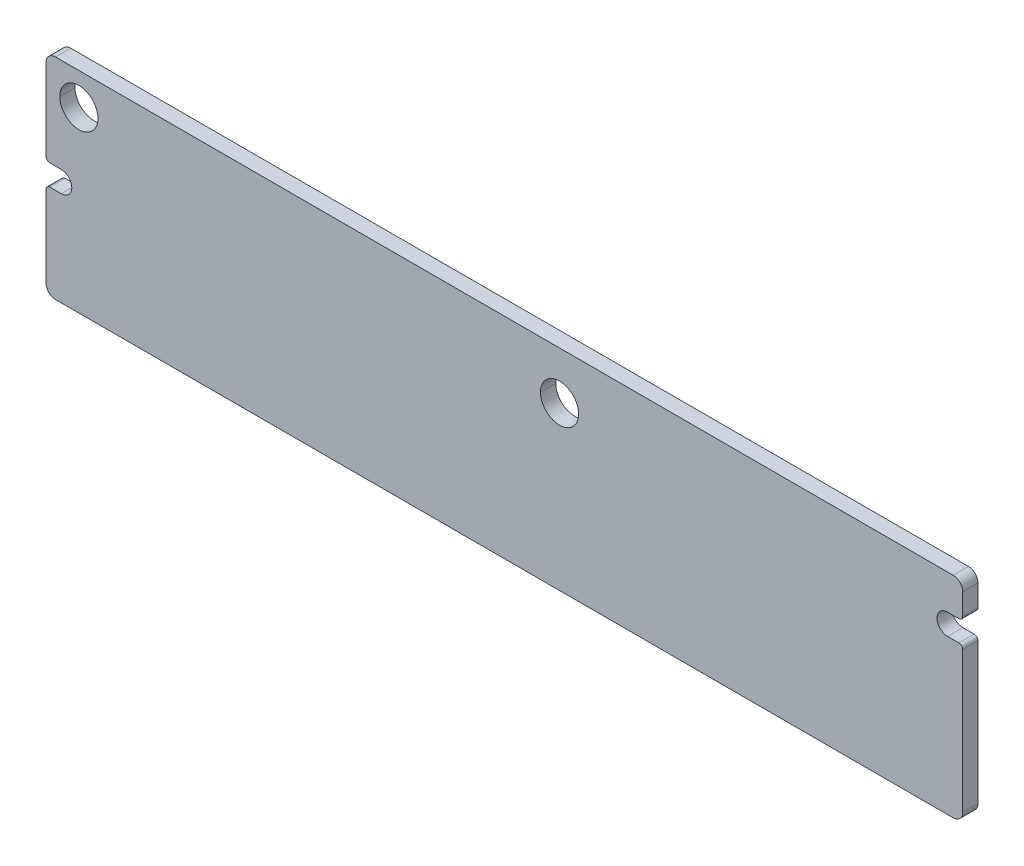
ISO-10303-21;
HEADER;
FILE_DESCRIPTION(('STEP AP214'),'2;1');
FILE_NAME('part.step','',(''),(''),'','','');
FILE_SCHEMA(('AUTOMOTIVE_DESIGN { 1 0 10303 214 1 1 1 1 }'));
ENDSEC;
DATA;
#1=APPLICATION_CONTEXT('core data for automotive mechanical design processes');
#2=APPLICATION_PROTOCOL_DEFINITION('international standard','automotive_design',2000,#1);
#3=PRODUCT_CONTEXT('',#1,'mechanical');
#4=PRODUCT('Part','Part','',(#3));
#5=PRODUCT_RELATED_PRODUCT_CATEGORY('part','',(#4));
#6=PRODUCT_DEFINITION_FORMATION('','',#4);
#7=PRODUCT_DEFINITION_CONTEXT('part definition',#1,'design');
#8=PRODUCT_DEFINITION('design','',#6,#7);
#9=PRODUCT_DEFINITION_SHAPE('','',#8);
#10=(LENGTH_UNIT() NAMED_UNIT(*) SI_UNIT(.MILLI.,.METRE.));
#11=(NAMED_UNIT(*) PLANE_ANGLE_UNIT() SI_UNIT($,.RADIAN.));
#12=(NAMED_UNIT(*) SI_UNIT($,.STERADIAN.) SOLID_ANGLE_UNIT());
#13=UNCERTAINTY_MEASURE_WITH_UNIT(LENGTH_MEASURE(1.E-05),#10,'distance_accuracy_value','');
#14=(GEOMETRIC_REPRESENTATION_CONTEXT(3) GLOBAL_UNCERTAINTY_ASSIGNED_CONTEXT((#13)) GLOBAL_UNIT_ASSIGNED_CONTEXT((#10,
#11,#12)) REPRESENTATION_CONTEXT('',''));
#15=CARTESIAN_POINT('',(0.,0.,0.));
#16=DIRECTION('',(0.,0.,1.));
#17=DIRECTION('',(1.,0.,0.));
#18=AXIS2_PLACEMENT_3D('',#15,#16,#17);
#19=CARTESIAN_POINT('',(32.7,45.43,-10.3962));
#20=DIRECTION('',(0.,1.,0.));
#21=DIRECTION('',(1.,0.,0.));
#22=AXIS2_PLACEMENT_3D('',#19,#20,#21);
#23=PLANE('',#22);
#24=DIRECTION('',(-1.,0.,0.));
#25=VECTOR('',#24,1.);
#26=CARTESIAN_POINT('',(32.5,45.43,-11.1962));
#27=LINE('',#26,#25);
#28=CARTESIAN_POINT('',(32.5,45.43,-11.1962));
#29=VERTEX_POINT('',#28);
#30=CARTESIAN_POINT('',(31.9,45.43,-11.1962));
#31=VERTEX_POINT('',#30);
#32=EDGE_CURVE('E395',#29,#31,#27,.T.);
#33=ORIENTED_EDGE('',*,*,#32,.T.);
#34=DIRECTION('',(0.,0.,-1.));
#35=VECTOR('',#34,1.);
#36=CARTESIAN_POINT('',(31.9,45.43,-10.3962));
#37=LINE('',#36,#35);
#38=CARTESIAN_POINT('',(31.9,45.43,-10.3962));
#39=VERTEX_POINT('',#38);
#40=EDGE_CURVE('E11',#39,#31,#37,.T.);
#41=ORIENTED_EDGE('',*,*,#40,.F.);
#42=DIRECTION('',(-1.,0.,0.));
#43=VECTOR('',#42,1.);
#44=CARTESIAN_POINT('',(32.5,45.43,-10.3962));
#45=LINE('',#44,#43);
#46=CARTESIAN_POINT('',(32.5,45.43,-10.3962));
#47=VERTEX_POINT('',#46);
#48=EDGE_CURVE('E268',#47,#39,#45,.T.);
#49=ORIENTED_EDGE('',*,*,#48,.F.);
#50=DIRECTION('',(0.,0.,-1.));
#51=VECTOR('',#50,1.);
#52=CARTESIAN_POINT('',(32.5,45.43,-10.3962));
#53=LINE('',#52,#51);
#54=EDGE_CURVE('E297',#47,#29,#53,.T.);
#55=ORIENTED_EDGE('',*,*,#54,.T.);
#56=EDGE_LOOP('',(#33,#41,#49,#55));
#57=FACE_BOUND('',#56,.T.);
#58=ADVANCED_FACE('F17',(#57),#23,.T.);
#59=CARTESIAN_POINT('',(31.9,45.98,-10.3962));
#60=DIRECTION('',(0.,0.,1.));
#61=DIRECTION('',(-1.,0.,0.));
#62=AXIS2_PLACEMENT_3D('',#59,#60,#61);
#63=CYLINDRICAL_SURFACE('',#62,0.55);
#64=ORIENTED_EDGE('',*,*,#40,.T.);
#65=CARTESIAN_POINT('',(31.9,45.98,-11.1962));
#66=DIRECTION('',(0.,0.,-1.));
#67=DIRECTION('',(0.,-1.,0.));
#68=AXIS2_PLACEMENT_3D('',#65,#66,#67);
#69=CIRCLE('',#68,0.55);
#70=CARTESIAN_POINT('',(31.9,46.53,-11.1962));
#71=VERTEX_POINT('',#70);
#72=EDGE_CURVE('E391',#31,#71,#69,.T.);
#73=ORIENTED_EDGE('',*,*,#72,.T.);
#74=DIRECTION('',(0.,0.,-1.));
#75=VECTOR('',#74,1.);
#76=CARTESIAN_POINT('',(31.9,46.53,-10.3962));
#77=LINE('',#76,#75);
#78=CARTESIAN_POINT('',(31.9,46.53,-10.3962));
#79=VERTEX_POINT('',#78);
#80=EDGE_CURVE('E28',#79,#71,#77,.T.);
#81=ORIENTED_EDGE('',*,*,#80,.F.);
#82=CARTESIAN_POINT('',(31.9,45.98,-10.3962));
#83=DIRECTION('',(0.,0.,-1.));
#84=DIRECTION('',(0.,-1.,0.));
#85=AXIS2_PLACEMENT_3D('',#82,#83,#84);
#86=CIRCLE('',#85,0.55);
#87=EDGE_CURVE('E259',#39,#79,#86,.T.);
#88=ORIENTED_EDGE('',*,*,#87,.F.);
#89=EDGE_LOOP('',(#64,#73,#81,#88));
#90=FACE_BOUND('',#89,.T.);
#91=ADVANCED_FACE('F547',(#90),#63,.F.);
#92=CARTESIAN_POINT('',(31.9,46.53,-10.3962));
#93=DIRECTION('',(0.,-1.,0.));
#94=DIRECTION('',(0.,0.,-1.));
#95=AXIS2_PLACEMENT_3D('',#92,#93,#94);
#96=PLANE('',#95);
#97=DIRECTION('',(1.,0.,0.));
#98=VECTOR('',#97,1.);
#99=CARTESIAN_POINT('',(31.9,46.53,-10.3962));
#100=LINE('',#99,#98);
#101=CARTESIAN_POINT('',(32.5,46.53,-10.3962));
#102=VERTEX_POINT('',#101);
#103=EDGE_CURVE('E237',#79,#102,#100,.T.);
#104=ORIENTED_EDGE('',*,*,#103,.F.);
#105=ORIENTED_EDGE('',*,*,#80,.T.);
#106=DIRECTION('',(1.,0.,0.));
#107=VECTOR('',#106,1.);
#108=CARTESIAN_POINT('',(31.9,46.53,-11.1962));
#109=LINE('',#108,#107);
#110=CARTESIAN_POINT('',(32.5,46.53,-11.1962));
#111=VERTEX_POINT('',#110);
#112=EDGE_CURVE('E240',#71,#111,#109,.T.);
#113=ORIENTED_EDGE('',*,*,#112,.T.);
#114=DIRECTION('',(0.,0.,-1.));
#115=VECTOR('',#114,1.);
#116=CARTESIAN_POINT('',(32.5,46.53,-10.3962));
#117=LINE('',#116,#115);
#118=EDGE_CURVE('E233',#102,#111,#117,.T.);
#119=ORIENTED_EDGE('',*,*,#118,.F.);
#120=EDGE_LOOP('',(#104,#105,#113,#119));
#121=FACE_BOUND('',#120,.T.);
#122=ADVANCED_FACE('F235',(#121),#96,.T.);
#123=CARTESIAN_POINT('',(32.5,46.73,14.59536632));
#124=DIRECTION('',(0.,0.,-1.));
#125=DIRECTION('',(1.,0.,0.));
#126=AXIS2_PLACEMENT_3D('',#123,#124,#125);
#127=CYLINDRICAL_SURFACE('',#126,0.2);
#128=DIRECTION('',(0.,0.,-1.));
#129=VECTOR('',#128,1.);
#130=CARTESIAN_POINT('',(32.7,46.73,-10.3962));
#131=LINE('',#130,#129);
#132=CARTESIAN_POINT('',(32.7,46.73,-10.3962));
#133=VERTEX_POINT('',#132);
#134=CARTESIAN_POINT('',(32.7,46.73,-11.1962));
#135=VERTEX_POINT('',#134);
#136=EDGE_CURVE('E245',#133,#135,#131,.T.);
#137=ORIENTED_EDGE('',*,*,#136,.F.);
#138=CARTESIAN_POINT('',(32.5,46.73,-10.3962));
#139=DIRECTION('',(0.,0.,1.));
#140=DIRECTION('',(0.,-1.,0.));
#141=AXIS2_PLACEMENT_3D('',#138,#139,#140);
#142=CIRCLE('',#141,0.2);
#143=EDGE_CURVE('E248',#102,#133,#142,.T.);
#144=ORIENTED_EDGE('',*,*,#143,.F.);
#145=ORIENTED_EDGE('',*,*,#118,.T.);
#146=CARTESIAN_POINT('',(32.5,46.73,-11.1962));
#147=DIRECTION('',(0.,0.,-1.));
#148=DIRECTION('',(1.,0.,0.));
#149=AXIS2_PLACEMENT_3D('',#146,#147,#148);
#150=CIRCLE('',#149,0.2);
#151=EDGE_CURVE('E441',#135,#111,#150,.T.);
#152=ORIENTED_EDGE('',*,*,#151,.F.);
#153=EDGE_LOOP('',(#137,#144,#145,#152));
#154=FACE_BOUND('',#153,.T.);
#155=ADVANCED_FACE('F249',(#154),#127,.T.);
#156=CARTESIAN_POINT('',(32.7,46.53,-10.3962));
#157=DIRECTION('',(1.,0.,0.));
#158=DIRECTION('',(0.,1.,0.));
#159=AXIS2_PLACEMENT_3D('',#156,#157,#158);
#160=PLANE('',#159);
#161=DIRECTION('',(0.,1.,0.));
#162=VECTOR('',#161,1.);
#163=CARTESIAN_POINT('',(32.7,46.73,-11.1962));
#164=LINE('',#163,#162);
#165=CARTESIAN_POINT('',(32.7,47.85,-11.1962));
#166=VERTEX_POINT('',#165);
#167=EDGE_CURVE('E438',#135,#166,#164,.T.);
#168=ORIENTED_EDGE('',*,*,#167,.T.);
#169=DIRECTION('',(0.,0.,-1.));
#170=VECTOR('',#169,1.);
#171=CARTESIAN_POINT('',(32.7,47.85,-10.3962));
#172=LINE('',#171,#170);
#173=CARTESIAN_POINT('',(32.7,47.85,-10.3962));
#174=VERTEX_POINT('',#173);
#175=EDGE_CURVE('E285',#174,#166,#172,.T.);
#176=ORIENTED_EDGE('',*,*,#175,.F.);
#177=DIRECTION('',(0.,1.,0.));
#178=VECTOR('',#177,1.);
#179=CARTESIAN_POINT('',(32.7,46.73,-10.3962));
#180=LINE('',#179,#178);
#181=EDGE_CURVE('E254',#133,#174,#180,.T.);
#182=ORIENTED_EDGE('',*,*,#181,.F.);
#183=ORIENTED_EDGE('',*,*,#136,.T.);
#184=EDGE_LOOP('',(#168,#176,#182,#183));
#185=FACE_BOUND('',#184,.T.);
#186=ADVANCED_FACE('F576',(#185),#160,.T.);
#187=CARTESIAN_POINT('',(32.2,47.85,14.59536632));
#188=DIRECTION('',(0.,0.,-1.));
#189=DIRECTION('',(0.,1.,0.));
#190=AXIS2_PLACEMENT_3D('',#187,#188,#189);
#191=CYLINDRICAL_SURFACE('',#190,0.5);
#192=DIRECTION('',(0.,0.,-1.));
#193=VECTOR('',#192,1.);
#194=CARTESIAN_POINT('',(32.2,48.35,-10.3962));
#195=LINE('',#194,#193);
#196=CARTESIAN_POINT('',(32.2,48.35,-10.3962));
#197=VERTEX_POINT('',#196);
#198=CARTESIAN_POINT('',(32.2,48.35,-11.1962));
#199=VERTEX_POINT('',#198);
#200=EDGE_CURVE('E282',#197,#199,#195,.T.);
#201=ORIENTED_EDGE('',*,*,#200,.F.);
#202=CARTESIAN_POINT('',(32.2,47.85,-10.3962));
#203=DIRECTION('',(0.,0.,1.));
#204=DIRECTION('',(1.,0.,0.));
#205=AXIS2_PLACEMENT_3D('',#202,#203,#204);
#206=CIRCLE('',#205,0.5);
#207=EDGE_CURVE('E386',#174,#197,#206,.T.);
#208=ORIENTED_EDGE('',*,*,#207,.F.);
#209=ORIENTED_EDGE('',*,*,#175,.T.);
#210=CARTESIAN_POINT('',(32.2,47.85,-11.1962));
#211=DIRECTION('',(0.,0.,-1.));
#212=DIRECTION('',(0.,1.,0.));
#213=AXIS2_PLACEMENT_3D('',#210,#211,#212);
#214=CIRCLE('',#213,0.5);
#215=EDGE_CURVE('E434',#199,#166,#214,.T.);
#216=ORIENTED_EDGE('',*,*,#215,.F.);
#217=EDGE_LOOP('',(#201,#208,#209,#216));
#218=FACE_BOUND('',#217,.T.);
#219=ADVANCED_FACE('F584',(#218),#191,.T.);
#220=CARTESIAN_POINT('',(32.7,48.35,-10.3962));
#221=DIRECTION('',(0.,1.,0.));
#222=DIRECTION('',(1.,0.,0.));
#223=AXIS2_PLACEMENT_3D('',#220,#221,#222);
#224=PLANE('',#223);
#225=DIRECTION('',(-1.,0.,0.));
#226=VECTOR('',#225,1.);
#227=CARTESIAN_POINT('',(32.2,48.35,-10.3962));
#228=LINE('',#227,#226);
#229=CARTESIAN_POINT('',(-14.8,48.35,-10.3962));
#230=VERTEX_POINT('',#229);
#231=EDGE_CURVE('E390',#197,#230,#228,.T.);
#232=ORIENTED_EDGE('',*,*,#231,.F.);
#233=ORIENTED_EDGE('',*,*,#200,.T.);
#234=DIRECTION('',(-1.,0.,0.));
#235=VECTOR('',#234,1.);
#236=CARTESIAN_POINT('',(32.2,48.35,-11.1962));
#237=LINE('',#236,#235);
#238=CARTESIAN_POINT('',(-14.8,48.35,-11.1962));
#239=VERTEX_POINT('',#238);
#240=EDGE_CURVE('E377',#199,#239,#237,.T.);
#241=ORIENTED_EDGE('',*,*,#240,.T.);
#242=DIRECTION('',(0.,0.,-1.));
#243=VECTOR('',#242,1.);
#244=CARTESIAN_POINT('',(-14.8,48.35,-10.3962));
#245=LINE('',#244,#243);
#246=EDGE_CURVE('E279',#230,#239,#245,.T.);
#247=ORIENTED_EDGE('',*,*,#246,.F.);
#248=EDGE_LOOP('',(#232,#233,#241,#247));
#249=FACE_BOUND('',#248,.T.);
#250=ADVANCED_FACE('F593',(#249),#224,.T.);
#251=CARTESIAN_POINT('',(-14.8,47.85,14.59536632));
#252=DIRECTION('',(0.,0.,-1.));
#253=DIRECTION('',(-1.,0.,0.));
#254=AXIS2_PLACEMENT_3D('',#251,#252,#253);
#255=CYLINDRICAL_SURFACE('',#254,0.5);
#256=DIRECTION('',(0.,0.,-1.));
#257=VECTOR('',#256,1.);
#258=CARTESIAN_POINT('',(-15.3,47.85,-10.3962));
#259=LINE('',#258,#257);
#260=CARTESIAN_POINT('',(-15.3,47.85,-10.3962));
#261=VERTEX_POINT('',#260);
#262=CARTESIAN_POINT('',(-15.3,47.85,-11.1962));
#263=VERTEX_POINT('',#262);
#264=EDGE_CURVE('E215',#261,#263,#259,.T.);
#265=ORIENTED_EDGE('',*,*,#264,.F.);
#266=CARTESIAN_POINT('',(-14.8,47.85,-10.3962));
#267=DIRECTION('',(0.,0.,1.));
#268=DIRECTION('',(0.,1.,0.));
#269=AXIS2_PLACEMENT_3D('',#266,#267,#268);
#270=CIRCLE('',#269,0.5);
#271=EDGE_CURVE('E405',#230,#261,#270,.T.);
#272=ORIENTED_EDGE('',*,*,#271,.F.);
#273=ORIENTED_EDGE('',*,*,#246,.T.);
#274=CARTESIAN_POINT('',(-14.8,47.85,-11.1962));
#275=DIRECTION('',(0.,0.,-1.));
#276=DIRECTION('',(-1.,0.,0.));
#277=AXIS2_PLACEMENT_3D('',#274,#275,#276);
#278=CIRCLE('',#277,0.5);
#279=EDGE_CURVE('E373',#263,#239,#278,.T.);
#280=ORIENTED_EDGE('',*,*,#279,.F.);
#281=EDGE_LOOP('',(#265,#272,#273,#280));
#282=FACE_BOUND('',#281,.T.);
#283=ADVANCED_FACE('F543',(#282),#255,.T.);
#284=CARTESIAN_POINT('',(-15.3,48.35,-10.3962));
#285=DIRECTION('',(-1.,0.,0.));
#286=DIRECTION('',(0.,0.,1.));
#287=AXIS2_PLACEMENT_3D('',#284,#285,#286);
#288=PLANE('',#287);
#289=DIRECTION('',(0.,-1.,0.));
#290=VECTOR('',#289,1.);
#291=CARTESIAN_POINT('',(-15.3,47.85,-10.3962));
#292=LINE('',#291,#290);
#293=CARTESIAN_POINT('',(-15.3,43.6,-10.3962));
#294=VERTEX_POINT('',#293);
#295=EDGE_CURVE('E400',#261,#294,#292,.T.);
#296=ORIENTED_EDGE('',*,*,#295,.F.);
#297=ORIENTED_EDGE('',*,*,#264,.T.);
#298=DIRECTION('',(0.,-1.,0.));
#299=VECTOR('',#298,1.);
#300=CARTESIAN_POINT('',(-15.3,47.85,-11.1962));
#301=LINE('',#300,#299);
#302=CARTESIAN_POINT('',(-15.3,43.6,-11.1962));
#303=VERTEX_POINT('',#302);
#304=EDGE_CURVE('E305',#263,#303,#301,.T.);
#305=ORIENTED_EDGE('',*,*,#304,.T.);
#306=DIRECTION('',(0.,0.,-1.));
#307=VECTOR('',#306,1.);
#308=CARTESIAN_POINT('',(-15.3,43.6,-10.3962));
#309=LINE('',#308,#307);
#310=EDGE_CURVE('E21',#294,#303,#309,.T.);
#311=ORIENTED_EDGE('',*,*,#310,.F.);
#312=EDGE_LOOP('',(#296,#297,#305,#311));
#313=FACE_BOUND('',#312,.T.);
#314=ADVANCED_FACE('F534',(#313),#288,.T.);
#315=CARTESIAN_POINT('',(-15.1,43.6,14.59536632));
#316=DIRECTION('',(0.,0.,-1.));
#317=DIRECTION('',(0.,-1.,0.));
#318=AXIS2_PLACEMENT_3D('',#315,#316,#317);
#319=CYLINDRICAL_SURFACE('',#318,0.2);
#320=DIRECTION('',(0.,0.,-1.));
#321=VECTOR('',#320,1.);
#322=CARTESIAN_POINT('',(-15.1,43.4,-10.3962));
#323=LINE('',#322,#321);
#324=CARTESIAN_POINT('',(-15.1,43.4,-10.3962));
#325=VERTEX_POINT('',#324);
#326=CARTESIAN_POINT('',(-15.1,43.4,-11.1962));
#327=VERTEX_POINT('',#326);
#328=EDGE_CURVE('E327',#325,#327,#323,.T.);
#329=ORIENTED_EDGE('',*,*,#328,.F.);
#330=CARTESIAN_POINT('',(-15.1,43.6,-10.3962));
#331=DIRECTION('',(0.,0.,1.));
#332=DIRECTION('',(-1.,0.,0.));
#333=AXIS2_PLACEMENT_3D('',#330,#331,#332);
#334=CIRCLE('',#333,0.2);
#335=EDGE_CURVE('E404',#294,#325,#334,.T.);
#336=ORIENTED_EDGE('',*,*,#335,.F.);
#337=ORIENTED_EDGE('',*,*,#310,.T.);
#338=CARTESIAN_POINT('',(-15.1,43.6,-11.1962));
#339=DIRECTION('',(0.,0.,-1.));
#340=DIRECTION('',(0.,-1.,0.));
#341=AXIS2_PLACEMENT_3D('',#338,#339,#340);
#342=CIRCLE('',#341,0.2);
#343=EDGE_CURVE('E295',#327,#303,#342,.T.);
#344=ORIENTED_EDGE('',*,*,#343,.F.);
#345=EDGE_LOOP('',(#329,#336,#337,#344));
#346=FACE_BOUND('',#345,.T.);
#347=ADVANCED_FACE('F532',(#346),#319,.T.);
#348=CARTESIAN_POINT('',(-15.3,43.4,-10.3962));
#349=DIRECTION('',(0.,-1.,0.));
#350=DIRECTION('',(0.,0.,-1.));
#351=AXIS2_PLACEMENT_3D('',#348,#349,#350);
#352=PLANE('',#351);
#353=DIRECTION('',(1.,0.,0.));
#354=VECTOR('',#353,1.);
#355=CARTESIAN_POINT('',(-15.1,43.4,-11.1962));
#356=LINE('',#355,#354);
#357=CARTESIAN_POINT('',(-14.5,43.4,-11.1962));
#358=VERTEX_POINT('',#357);
#359=EDGE_CURVE('E291',#327,#358,#356,.T.);
#360=ORIENTED_EDGE('',*,*,#359,.T.);
#361=DIRECTION('',(0.,0.,-1.));
#362=VECTOR('',#361,1.);
#363=CARTESIAN_POINT('',(-14.5,43.4,-10.3962));
#364=LINE('',#363,#362);
#365=CARTESIAN_POINT('',(-14.5,43.4,-10.3962));
#366=VERTEX_POINT('',#365);
#367=EDGE_CURVE('E329',#366,#358,#364,.T.);
#368=ORIENTED_EDGE('',*,*,#367,.F.);
#369=DIRECTION('',(1.,0.,0.));
#370=VECTOR('',#369,1.);
#371=CARTESIAN_POINT('',(-15.1,43.4,-10.3962));
#372=LINE('',#371,#370);
#373=EDGE_CURVE('E411',#325,#366,#372,.T.);
#374=ORIENTED_EDGE('',*,*,#373,.F.);
#375=ORIENTED_EDGE('',*,*,#328,.T.);
#376=EDGE_LOOP('',(#360,#368,#374,#375));
#377=FACE_BOUND('',#376,.T.);
#378=ADVANCED_FACE('F530',(#377),#352,.T.);
#379=CARTESIAN_POINT('',(-14.5,42.85,-10.3962));
#380=DIRECTION('',(0.,0.,1.));
#381=DIRECTION('',(-1.,0.,0.));
#382=AXIS2_PLACEMENT_3D('',#379,#380,#381);
#383=CYLINDRICAL_SURFACE('',#382,0.55);
#384=ORIENTED_EDGE('',*,*,#367,.T.);
#385=CARTESIAN_POINT('',(-14.5,42.85,-11.1962));
#386=DIRECTION('',(0.,0.,-1.));
#387=DIRECTION('',(0.,1.,0.));
#388=AXIS2_PLACEMENT_3D('',#385,#386,#387);
#389=CIRCLE('',#388,0.55);
#390=CARTESIAN_POINT('',(-14.5,42.3,-11.1962));
#391=VERTEX_POINT('',#390);
#392=EDGE_CURVE('E296',#358,#391,#389,.T.);
#393=ORIENTED_EDGE('',*,*,#392,.T.);
#394=DIRECTION('',(0.,0.,-1.));
#395=VECTOR('',#394,1.);
#396=CARTESIAN_POINT('',(-14.5,42.3,-10.3962));
#397=LINE('',#396,#395);
#398=CARTESIAN_POINT('',(-14.5,42.3,-10.3962));
#399=VERTEX_POINT('',#398);
#400=EDGE_CURVE('E321',#399,#391,#397,.T.);
#401=ORIENTED_EDGE('',*,*,#400,.F.);
#402=CARTESIAN_POINT('',(-14.5,42.85,-10.3962));
#403=DIRECTION('',(0.,0.,-1.));
#404=DIRECTION('',(0.,1.,0.));
#405=AXIS2_PLACEMENT_3D('',#402,#403,#404);
#406=CIRCLE('',#405,0.55);
#407=EDGE_CURVE('E461',#366,#399,#406,.T.);
#408=ORIENTED_EDGE('',*,*,#407,.F.);
#409=EDGE_LOOP('',(#384,#393,#401,#408));
#410=FACE_BOUND('',#409,.T.);
#411=ADVANCED_FACE('F526',(#410),#383,.F.);
#412=CARTESIAN_POINT('',(-14.5,42.3,-10.3962));
#413=DIRECTION('',(0.,1.,0.));
#414=DIRECTION('',(1.,0.,0.));
#415=AXIS2_PLACEMENT_3D('',#412,#413,#414);
#416=PLANE('',#415);
#417=DIRECTION('',(-1.,0.,0.));
#418=VECTOR('',#417,1.);
#419=CARTESIAN_POINT('',(-14.5,42.3,-10.3962));
#420=LINE('',#419,#418);
#421=CARTESIAN_POINT('',(-15.1,42.3,-10.3962));
#422=VERTEX_POINT('',#421);
#423=EDGE_CURVE('E465',#399,#422,#420,.T.);
#424=ORIENTED_EDGE('',*,*,#423,.F.);
#425=ORIENTED_EDGE('',*,*,#400,.T.);
#426=DIRECTION('',(-1.,0.,0.));
#427=VECTOR('',#426,1.);
#428=CARTESIAN_POINT('',(-14.5,42.3,-11.1962));
#429=LINE('',#428,#427);
#430=CARTESIAN_POINT('',(-15.1,42.3,-11.1962));
#431=VERTEX_POINT('',#430);
#432=EDGE_CURVE('E326',#391,#431,#429,.T.);
#433=ORIENTED_EDGE('',*,*,#432,.T.);
#434=DIRECTION('',(0.,0.,-1.));
#435=VECTOR('',#434,1.);
#436=CARTESIAN_POINT('',(-15.1,42.3,-10.3962));
#437=LINE('',#436,#435);
#438=EDGE_CURVE('E318',#422,#431,#437,.T.);
#439=ORIENTED_EDGE('',*,*,#438,.F.);
#440=EDGE_LOOP('',(#424,#425,#433,#439));
#441=FACE_BOUND('',#440,.T.);
#442=ADVANCED_FACE('F522',(#441),#416,.T.);
#443=CARTESIAN_POINT('',(-15.1,42.1,14.59536632));
#444=DIRECTION('',(0.,0.,-1.));
#445=DIRECTION('',(-1.,0.,0.));
#446=AXIS2_PLACEMENT_3D('',#443,#444,#445);
#447=CYLINDRICAL_SURFACE('',#446,0.2);
#448=DIRECTION('',(0.,0.,-1.));
#449=VECTOR('',#448,1.);
#450=CARTESIAN_POINT('',(-15.3,42.1,-10.3962));
#451=LINE('',#450,#449);
#452=CARTESIAN_POINT('',(-15.3,42.1,-10.3962));
#453=VERTEX_POINT('',#452);
#454=CARTESIAN_POINT('',(-15.3,42.1,-11.1962));
#455=VERTEX_POINT('',#454);
#456=EDGE_CURVE('E322',#453,#455,#451,.T.);
#457=ORIENTED_EDGE('',*,*,#456,.F.);
#458=CARTESIAN_POINT('',(-15.1,42.1,-10.3962));
#459=DIRECTION('',(0.,0.,1.));
#460=DIRECTION('',(0.,1.,0.));
#461=AXIS2_PLACEMENT_3D('',#458,#459,#460);
#462=CIRCLE('',#461,0.2);
#463=EDGE_CURVE('E432',#422,#453,#462,.T.);
#464=ORIENTED_EDGE('',*,*,#463,.F.);
#465=ORIENTED_EDGE('',*,*,#438,.T.);
#466=CARTESIAN_POINT('',(-15.1,42.1,-11.1962));
#467=DIRECTION('',(0.,0.,-1.));
#468=DIRECTION('',(-1.,0.,0.));
#469=AXIS2_PLACEMENT_3D('',#466,#467,#468);
#470=CIRCLE('',#469,0.2);
#471=EDGE_CURVE('E358',#455,#431,#470,.T.);
#472=ORIENTED_EDGE('',*,*,#471,.F.);
#473=EDGE_LOOP('',(#457,#464,#465,#472));
#474=FACE_BOUND('',#473,.T.);
#475=ADVANCED_FACE('F518',(#474),#447,.T.);
#476=CARTESIAN_POINT('',(-15.3,42.3,-10.3962));
#477=DIRECTION('',(-1.,0.,0.));
#478=DIRECTION('',(0.,0.,1.));
#479=AXIS2_PLACEMENT_3D('',#476,#477,#478);
#480=PLANE('',#479);
#481=DIRECTION('',(0.,-1.,0.));
#482=VECTOR('',#481,1.);
#483=CARTESIAN_POINT('',(-15.3,42.1,-11.1962));
#484=LINE('',#483,#482);
#485=CARTESIAN_POINT('',(-15.3,37.85,-11.1962));
#486=VERTEX_POINT('',#485);
#487=EDGE_CURVE('E429',#455,#486,#484,.T.);
#488=ORIENTED_EDGE('',*,*,#487,.T.);
#489=DIRECTION('',(0.,0.,-1.));
#490=VECTOR('',#489,1.);
#491=CARTESIAN_POINT('',(-15.3,37.85,-10.3962));
#492=LINE('',#491,#490);
#493=CARTESIAN_POINT('',(-15.3,37.85,-10.3962));
#494=VERTEX_POINT('',#493);
#495=EDGE_CURVE('E289',#494,#486,#492,.T.);
#496=ORIENTED_EDGE('',*,*,#495,.F.);
#497=DIRECTION('',(0.,-1.,0.));
#498=VECTOR('',#497,1.);
#499=CARTESIAN_POINT('',(-15.3,42.1,-10.3962));
#500=LINE('',#499,#498);
#501=EDGE_CURVE('E421',#453,#494,#500,.T.);
#502=ORIENTED_EDGE('',*,*,#501,.F.);
#503=ORIENTED_EDGE('',*,*,#456,.T.);
#504=EDGE_LOOP('',(#488,#496,#502,#503));
#505=FACE_BOUND('',#504,.T.);
#506=ADVANCED_FACE('F563',(#505),#480,.T.);
#507=CARTESIAN_POINT('',(-14.8,37.85,14.59536632));
#508=DIRECTION('',(0.,0.,-1.));
#509=DIRECTION('',(0.,-1.,0.));
#510=AXIS2_PLACEMENT_3D('',#507,#508,#509);
#511=CYLINDRICAL_SURFACE('',#510,0.5);
#512=DIRECTION('',(0.,0.,-1.));
#513=VECTOR('',#512,1.);
#514=CARTESIAN_POINT('',(-14.8,37.35,-10.3962));
#515=LINE('',#514,#513);
#516=CARTESIAN_POINT('',(-14.8,37.35,-10.3962));
#517=VERTEX_POINT('',#516);
#518=CARTESIAN_POINT('',(-14.8,37.35,-11.1962));
#519=VERTEX_POINT('',#518);
#520=EDGE_CURVE('E286',#517,#519,#515,.T.);
#521=ORIENTED_EDGE('',*,*,#520,.F.);
#522=CARTESIAN_POINT('',(-14.8,37.85,-10.3962));
#523=DIRECTION('',(0.,0.,1.));
#524=DIRECTION('',(-1.,0.,0.));
#525=AXIS2_PLACEMENT_3D('',#522,#523,#524);
#526=CIRCLE('',#525,0.5);
#527=EDGE_CURVE('E416',#494,#517,#526,.T.);
#528=ORIENTED_EDGE('',*,*,#527,.F.);
#529=ORIENTED_EDGE('',*,*,#495,.T.);
#530=CARTESIAN_POINT('',(-14.8,37.85,-11.1962));
#531=DIRECTION('',(0.,0.,-1.));
#532=DIRECTION('',(0.,-1.,0.));
#533=AXIS2_PLACEMENT_3D('',#530,#531,#532);
#534=CIRCLE('',#533,0.5);
#535=EDGE_CURVE('E316',#519,#486,#534,.T.);
#536=ORIENTED_EDGE('',*,*,#535,.F.);
#537=EDGE_LOOP('',(#521,#528,#529,#536));
#538=FACE_BOUND('',#537,.T.);
#539=ADVANCED_FACE('F566',(#538),#511,.T.);
#540=CARTESIAN_POINT('',(-15.3,37.35,-10.3962));
#541=DIRECTION('',(0.,-1.,0.));
#542=DIRECTION('',(0.,0.,-1.));
#543=AXIS2_PLACEMENT_3D('',#540,#541,#542);
#544=PLANE('',#543);
#545=DIRECTION('',(1.,0.,0.));
#546=VECTOR('',#545,1.);
#547=CARTESIAN_POINT('',(-14.8,37.35,-11.1962));
#548=LINE('',#547,#546);
#549=CARTESIAN_POINT('',(32.2,37.35,-11.1962));
#550=VERTEX_POINT('',#549);
#551=EDGE_CURVE('E312',#519,#550,#548,.T.);
#552=ORIENTED_EDGE('',*,*,#551,.T.);
#553=DIRECTION('',(0.,0.,-1.));
#554=VECTOR('',#553,1.);
#555=CARTESIAN_POINT('',(32.2,37.35,-10.3962));
#556=LINE('',#555,#554);
#557=CARTESIAN_POINT('',(32.2,37.35,-10.3962));
#558=VERTEX_POINT('',#557);
#559=EDGE_CURVE('E290',#558,#550,#556,.T.);
#560=ORIENTED_EDGE('',*,*,#559,.F.);
#561=DIRECTION('',(1.,0.,0.));
#562=VECTOR('',#561,1.);
#563=CARTESIAN_POINT('',(-14.8,37.35,-10.3962));
#564=LINE('',#563,#562);
#565=EDGE_CURVE('E420',#517,#558,#564,.T.);
#566=ORIENTED_EDGE('',*,*,#565,.F.);
#567=ORIENTED_EDGE('',*,*,#520,.T.);
#568=EDGE_LOOP('',(#552,#560,#566,#567));
#569=FACE_BOUND('',#568,.T.);
#570=ADVANCED_FACE('F588',(#569),#544,.T.);
#571=CARTESIAN_POINT('',(32.2,37.85,14.59536632));
#572=DIRECTION('',(0.,0.,-1.));
#573=DIRECTION('',(1.,0.,0.));
#574=AXIS2_PLACEMENT_3D('',#571,#572,#573);
#575=CYLINDRICAL_SURFACE('',#574,0.5);
#576=DIRECTION('',(0.,0.,-1.));
#577=VECTOR('',#576,1.);
#578=CARTESIAN_POINT('',(32.7,37.85,-10.3962));
#579=LINE('',#578,#577);
#580=CARTESIAN_POINT('',(32.7,37.85,-10.3962));
#581=VERTEX_POINT('',#580);
#582=CARTESIAN_POINT('',(32.7,37.85,-11.1962));
#583=VERTEX_POINT('',#582);
#584=EDGE_CURVE('E380',#581,#583,#579,.T.);
#585=ORIENTED_EDGE('',*,*,#584,.F.);
#586=CARTESIAN_POINT('',(32.2,37.85,-10.3962));
#587=DIRECTION('',(0.,0.,1.));
#588=DIRECTION('',(0.,-1.,0.));
#589=AXIS2_PLACEMENT_3D('',#586,#587,#588);
#590=CIRCLE('',#589,0.5);
#591=EDGE_CURVE('E272',#558,#581,#590,.T.);
#592=ORIENTED_EDGE('',*,*,#591,.F.);
#593=ORIENTED_EDGE('',*,*,#559,.T.);
#594=CARTESIAN_POINT('',(32.2,37.85,-11.1962));
#595=DIRECTION('',(0.,0.,-1.));
#596=DIRECTION('',(1.,0.,0.));
#597=AXIS2_PLACEMENT_3D('',#594,#595,#596);
#598=CIRCLE('',#597,0.5);
#599=EDGE_CURVE('E317',#583,#550,#598,.T.);
#600=ORIENTED_EDGE('',*,*,#599,.F.);
#601=EDGE_LOOP('',(#585,#592,#593,#600));
#602=FACE_BOUND('',#601,.T.);
#603=ADVANCED_FACE('F1230',(#602),#575,.T.);
#604=CARTESIAN_POINT('',(32.7,37.35,-10.3962));
#605=DIRECTION('',(1.,0.,0.));
#606=DIRECTION('',(0.,1.,0.));
#607=AXIS2_PLACEMENT_3D('',#604,#605,#606);
#608=PLANE('',#607);
#609=DIRECTION('',(0.,1.,0.));
#610=VECTOR('',#609,1.);
#611=CARTESIAN_POINT('',(32.7,37.85,-10.3962));
#612=LINE('',#611,#610);
#613=CARTESIAN_POINT('',(32.7,45.23,-10.3962));
#614=VERTEX_POINT('',#613);
#615=EDGE_CURVE('E354',#581,#614,#612,.T.);
#616=ORIENTED_EDGE('',*,*,#615,.F.);
#617=ORIENTED_EDGE('',*,*,#584,.T.);
#618=DIRECTION('',(0.,1.,0.));
#619=VECTOR('',#618,1.);
#620=CARTESIAN_POINT('',(32.7,37.85,-11.1962));
#621=LINE('',#620,#619);
#622=CARTESIAN_POINT('',(32.7,45.23,-11.1962));
#623=VERTEX_POINT('',#622);
#624=EDGE_CURVE('E360',#583,#623,#621,.T.);
#625=ORIENTED_EDGE('',*,*,#624,.T.);
#626=DIRECTION('',(0.,0.,-1.));
#627=VECTOR('',#626,1.);
#628=CARTESIAN_POINT('',(32.7,45.23,-10.3962));
#629=LINE('',#628,#627);
#630=EDGE_CURVE('E300',#614,#623,#629,.T.);
#631=ORIENTED_EDGE('',*,*,#630,.F.);
#632=EDGE_LOOP('',(#616,#617,#625,#631));
#633=FACE_BOUND('',#632,.T.);
#634=ADVANCED_FACE('F1240',(#633),#608,.T.);
#635=CARTESIAN_POINT('',(32.5,45.23,14.59536632));
#636=DIRECTION('',(0.,0.,-1.));
#637=DIRECTION('',(0.,1.,0.));
#638=AXIS2_PLACEMENT_3D('',#635,#636,#637);
#639=CYLINDRICAL_SURFACE('',#638,0.2);
#640=ORIENTED_EDGE('',*,*,#54,.F.);
#641=CARTESIAN_POINT('',(32.5,45.23,-10.3962));
#642=DIRECTION('',(0.,0.,1.));
#643=DIRECTION('',(1.,0.,0.));
#644=AXIS2_PLACEMENT_3D('',#641,#642,#643);
#645=CIRCLE('',#644,0.2);
#646=EDGE_CURVE('E346',#614,#47,#645,.T.);
#647=ORIENTED_EDGE('',*,*,#646,.F.);
#648=ORIENTED_EDGE('',*,*,#630,.T.);
#649=CARTESIAN_POINT('',(32.5,45.23,-11.1962));
#650=DIRECTION('',(0.,0.,-1.));
#651=DIRECTION('',(0.,1.,0.));
#652=AXIS2_PLACEMENT_3D('',#649,#650,#651);
#653=CIRCLE('',#652,0.2);
#654=EDGE_CURVE('E278',#29,#623,#653,.T.);
#655=ORIENTED_EDGE('',*,*,#654,.F.);
#656=EDGE_LOOP('',(#640,#647,#648,#655));
#657=FACE_BOUND('',#656,.T.);
#658=ADVANCED_FACE('F19',(#657),#639,.T.);
#659=CARTESIAN_POINT('',(11.59,45.85,-11.1962));
#660=DIRECTION('',(0.,0.,-1.));
#661=DIRECTION('',(1.,0.,0.));
#662=AXIS2_PLACEMENT_3D('',#659,#660,#661);
#663=CYLINDRICAL_SURFACE('',#662,1.);
#664=DIRECTION('',(0.,0.,-1.));
#665=VECTOR('',#664,1.);
#666=CARTESIAN_POINT('',(10.59,45.85,-10.3962));
#667=LINE('',#666,#665);
#668=CARTESIAN_POINT('',(10.59,45.85,-10.3962));
#669=VERTEX_POINT('',#668);
#670=CARTESIAN_POINT('',(10.59,45.85,-11.1962));
#671=VERTEX_POINT('',#670);
#672=EDGE_CURVE('E301',#669,#671,#667,.T.);
#673=ORIENTED_EDGE('',*,*,#672,.T.);
#674=CARTESIAN_POINT('',(11.59,45.85,-11.1962));
#675=DIRECTION('',(0.,0.,-1.));
#676=DIRECTION('',(-1.,0.,0.));
#677=AXIS2_PLACEMENT_3D('',#674,#675,#676);
#678=CIRCLE('',#677,1.);
#679=CARTESIAN_POINT('',(12.59,45.85,-11.1962));
#680=VERTEX_POINT('',#679);
#681=EDGE_CURVE('E274',#671,#680,#678,.T.);
#682=ORIENTED_EDGE('',*,*,#681,.T.);
#683=DIRECTION('',(0.,0.,-1.));
#684=VECTOR('',#683,1.);
#685=CARTESIAN_POINT('',(12.59,45.85,-10.3962));
#686=LINE('',#685,#684);
#687=CARTESIAN_POINT('',(12.59,45.85,-10.3962));
#688=VERTEX_POINT('',#687);
#689=EDGE_CURVE('E42',#688,#680,#686,.T.);
#690=ORIENTED_EDGE('',*,*,#689,.F.);
#691=CARTESIAN_POINT('',(11.59,45.85,-10.3962));
#692=DIRECTION('',(0.,0.,-1.));
#693=DIRECTION('',(-1.,0.,0.));
#694=AXIS2_PLACEMENT_3D('',#691,#692,#693);
#695=CIRCLE('',#694,1.);
#696=EDGE_CURVE('E334',#669,#688,#695,.T.);
#697=ORIENTED_EDGE('',*,*,#696,.F.);
#698=EDGE_LOOP('',(#673,#682,#690,#697));
#699=FACE_BOUND('',#698,.T.);
#700=ADVANCED_FACE('F591',(#699),#663,.F.);
#701=CARTESIAN_POINT('',(11.59,45.85,-11.1962));
#702=DIRECTION('',(0.,0.,-1.));
#703=DIRECTION('',(1.,0.,0.));
#704=AXIS2_PLACEMENT_3D('',#701,#702,#703);
#705=CYLINDRICAL_SURFACE('',#704,1.);
#706=ORIENTED_EDGE('',*,*,#689,.T.);
#707=CARTESIAN_POINT('',(11.59,45.85,-11.1962));
#708=DIRECTION('',(0.,0.,-1.));
#709=DIRECTION('',(1.,0.,0.));
#710=AXIS2_PLACEMENT_3D('',#707,#708,#709);
#711=CIRCLE('',#710,1.);
#712=EDGE_CURVE('E277',#680,#671,#711,.T.);
#713=ORIENTED_EDGE('',*,*,#712,.T.);
#714=ORIENTED_EDGE('',*,*,#672,.F.);
#715=CARTESIAN_POINT('',(11.59,45.85,-10.3962));
#716=DIRECTION('',(0.,0.,-1.));
#717=DIRECTION('',(1.,0.,0.));
#718=AXIS2_PLACEMENT_3D('',#715,#716,#717);
#719=CIRCLE('',#718,1.);
#720=EDGE_CURVE('E330',#688,#669,#719,.T.);
#721=ORIENTED_EDGE('',*,*,#720,.F.);
#722=EDGE_LOOP('',(#706,#713,#714,#721));
#723=FACE_BOUND('',#722,.T.);
#724=ADVANCED_FACE('F561',(#723),#705,.F.);
#725=CARTESIAN_POINT('',(0.,0.,-11.1962));
#726=DIRECTION('',(0.,0.,1.));
#727=DIRECTION('',(1.,0.,0.));
#728=AXIS2_PLACEMENT_3D('',#725,#726,#727);
#729=PLANE('',#728);
#730=CARTESIAN_POINT('',(-13.58,46.67,-11.1962));
#731=DIRECTION('',(0.,0.,-1.));
#732=DIRECTION('',(-1.,0.,0.));
#733=AXIS2_PLACEMENT_3D('',#730,#731,#732);
#734=CIRCLE('',#733,1.);
#735=CARTESIAN_POINT('',(-14.58,46.67,-11.1962));
#736=VERTEX_POINT('',#735);
#737=CARTESIAN_POINT('',(-12.58,46.67,-11.1962));
#738=VERTEX_POINT('',#737);
#739=EDGE_CURVE('E310',#736,#738,#734,.T.);
#740=ORIENTED_EDGE('',*,*,#739,.F.);
#741=CARTESIAN_POINT('',(-13.58,46.67,-11.1962));
#742=DIRECTION('',(0.,0.,-1.));
#743=DIRECTION('',(1.,0.,0.));
#744=AXIS2_PLACEMENT_3D('',#741,#742,#743);
#745=CIRCLE('',#744,1.);
#746=EDGE_CURVE('E311',#738,#736,#745,.T.);
#747=ORIENTED_EDGE('',*,*,#746,.F.);
#748=EDGE_LOOP('',(#740,#747));
#749=FACE_BOUND('',#748,.T.);
#750=ORIENTED_EDGE('',*,*,#681,.F.);
#751=ORIENTED_EDGE('',*,*,#712,.F.);
#752=EDGE_LOOP('',(#750,#751));
#753=FACE_BOUND('',#752,.T.);
#754=ORIENTED_EDGE('',*,*,#624,.F.);
#755=ORIENTED_EDGE('',*,*,#599,.T.);
#756=ORIENTED_EDGE('',*,*,#551,.F.);
#757=ORIENTED_EDGE('',*,*,#535,.T.);
#758=ORIENTED_EDGE('',*,*,#487,.F.);
#759=ORIENTED_EDGE('',*,*,#471,.T.);
#760=ORIENTED_EDGE('',*,*,#432,.F.);
#761=ORIENTED_EDGE('',*,*,#392,.F.);
#762=ORIENTED_EDGE('',*,*,#359,.F.);
#763=ORIENTED_EDGE('',*,*,#343,.T.);
#764=ORIENTED_EDGE('',*,*,#304,.F.);
#765=ORIENTED_EDGE('',*,*,#279,.T.);
#766=ORIENTED_EDGE('',*,*,#240,.F.);
#767=ORIENTED_EDGE('',*,*,#215,.T.);
#768=ORIENTED_EDGE('',*,*,#167,.F.);
#769=ORIENTED_EDGE('',*,*,#151,.T.);
#770=ORIENTED_EDGE('',*,*,#112,.F.);
#771=ORIENTED_EDGE('',*,*,#72,.F.);
#772=ORIENTED_EDGE('',*,*,#32,.F.);
#773=ORIENTED_EDGE('',*,*,#654,.T.);
#774=EDGE_LOOP('',(#754,#755,#756,#757,#758,#759,#760,#761,#762,#763,#764,#765,#766,#767,#768,
#769,#770,#771,#772,#773));
#775=FACE_BOUND('',#774,.T.);
#776=ADVANCED_FACE('F515',(#749,#753,#775),#729,.F.);
#777=CARTESIAN_POINT('',(-13.58,46.67,-11.1962));
#778=DIRECTION('',(0.,0.,-1.));
#779=DIRECTION('',(1.,0.,0.));
#780=AXIS2_PLACEMENT_3D('',#777,#778,#779);
#781=CYLINDRICAL_SURFACE('',#780,1.);
#782=DIRECTION('',(0.,0.,-1.));
#783=VECTOR('',#782,1.);
#784=CARTESIAN_POINT('',(-14.58,46.67,-10.3962));
#785=LINE('',#784,#783);
#786=CARTESIAN_POINT('',(-14.58,46.67,-10.3962));
#787=VERTEX_POINT('',#786);
#788=EDGE_CURVE('E306',#787,#736,#785,.T.);
#789=ORIENTED_EDGE('',*,*,#788,.T.);
#790=ORIENTED_EDGE('',*,*,#739,.T.);
#791=DIRECTION('',(0.,0.,-1.));
#792=VECTOR('',#791,1.);
#793=CARTESIAN_POINT('',(-12.58,46.67,-10.3962));
#794=LINE('',#793,#792);
#795=CARTESIAN_POINT('',(-12.58,46.67,-10.3962));
#796=VERTEX_POINT('',#795);
#797=EDGE_CURVE('E369',#796,#738,#794,.T.);
#798=ORIENTED_EDGE('',*,*,#797,.F.);
#799=CARTESIAN_POINT('',(-13.58,46.67,-10.3962));
#800=DIRECTION('',(0.,0.,-1.));
#801=DIRECTION('',(-1.,0.,0.));
#802=AXIS2_PLACEMENT_3D('',#799,#800,#801);
#803=CIRCLE('',#802,1.);
#804=EDGE_CURVE('E333',#787,#796,#803,.T.);
#805=ORIENTED_EDGE('',*,*,#804,.F.);
#806=EDGE_LOOP('',(#789,#790,#798,#805));
#807=FACE_BOUND('',#806,.T.);
#808=ADVANCED_FACE('F560',(#807),#781,.F.);
#809=CARTESIAN_POINT('',(-13.58,46.67,-11.1962));
#810=DIRECTION('',(0.,0.,-1.));
#811=DIRECTION('',(1.,0.,0.));
#812=AXIS2_PLACEMENT_3D('',#809,#810,#811);
#813=CYLINDRICAL_SURFACE('',#812,1.);
#814=ORIENTED_EDGE('',*,*,#797,.T.);
#815=ORIENTED_EDGE('',*,*,#746,.T.);
#816=ORIENTED_EDGE('',*,*,#788,.F.);
#817=CARTESIAN_POINT('',(-13.58,46.67,-10.3962));
#818=DIRECTION('',(0.,0.,-1.));
#819=DIRECTION('',(1.,0.,0.));
#820=AXIS2_PLACEMENT_3D('',#817,#818,#819);
#821=CIRCLE('',#820,1.);
#822=EDGE_CURVE('E343',#796,#787,#821,.T.);
#823=ORIENTED_EDGE('',*,*,#822,.F.);
#824=EDGE_LOOP('',(#814,#815,#816,#823));
#825=FACE_BOUND('',#824,.T.);
#826=ADVANCED_FACE('F570',(#825),#813,.F.);
#827=CARTESIAN_POINT('',(0.,0.,-10.3962));
#828=DIRECTION('',(0.,0.,1.));
#829=DIRECTION('',(1.,0.,0.));
#830=AXIS2_PLACEMENT_3D('',#827,#828,#829);
#831=PLANE('',#830);
#832=ORIENTED_EDGE('',*,*,#804,.T.);
#833=ORIENTED_EDGE('',*,*,#822,.T.);
#834=EDGE_LOOP('',(#832,#833));
#835=FACE_BOUND('',#834,.T.);
#836=ORIENTED_EDGE('',*,*,#696,.T.);
#837=ORIENTED_EDGE('',*,*,#720,.T.);
#838=EDGE_LOOP('',(#836,#837));
#839=FACE_BOUND('',#838,.T.);
#840=ORIENTED_EDGE('',*,*,#48,.T.);
#841=ORIENTED_EDGE('',*,*,#87,.T.);
#842=ORIENTED_EDGE('',*,*,#103,.T.);
#843=ORIENTED_EDGE('',*,*,#143,.T.);
#844=ORIENTED_EDGE('',*,*,#181,.T.);
#845=ORIENTED_EDGE('',*,*,#207,.T.);
#846=ORIENTED_EDGE('',*,*,#231,.T.);
#847=ORIENTED_EDGE('',*,*,#271,.T.);
#848=ORIENTED_EDGE('',*,*,#295,.T.);
#849=ORIENTED_EDGE('',*,*,#335,.T.);
#850=ORIENTED_EDGE('',*,*,#373,.T.);
#851=ORIENTED_EDGE('',*,*,#407,.T.);
#852=ORIENTED_EDGE('',*,*,#423,.T.);
#853=ORIENTED_EDGE('',*,*,#463,.T.);
#854=ORIENTED_EDGE('',*,*,#501,.T.);
#855=ORIENTED_EDGE('',*,*,#527,.T.);
#856=ORIENTED_EDGE('',*,*,#565,.T.);
#857=ORIENTED_EDGE('',*,*,#591,.T.);
#858=ORIENTED_EDGE('',*,*,#615,.T.);
#859=ORIENTED_EDGE('',*,*,#646,.T.);
#860=EDGE_LOOP('',(#840,#841,#842,#843,#844,#845,#846,#847,#848,#849,#850,#851,#852,#853,#854,
#855,#856,#857,#858,#859));
#861=FACE_BOUND('',#860,.T.);
#862=ADVANCED_FACE('F257',(#835,#839,#861),#831,.T.);
#863=CLOSED_SHELL('',(#58,#91,#122,#155,#186,#219,#250,#283,#314,#347,#378,#411,#442,#475,#506,
#539,#570,#603,#634,#658,#700,#724,#776,#808,#826,#862));
#864=MANIFOLD_SOLID_BREP('B1',#863);
#865=ADVANCED_BREP_SHAPE_REPRESENTATION('',(#18,#864),#14);
#866=SHAPE_DEFINITION_REPRESENTATION(#9,#865);
ENDSEC;
END-ISO-10303-21;
